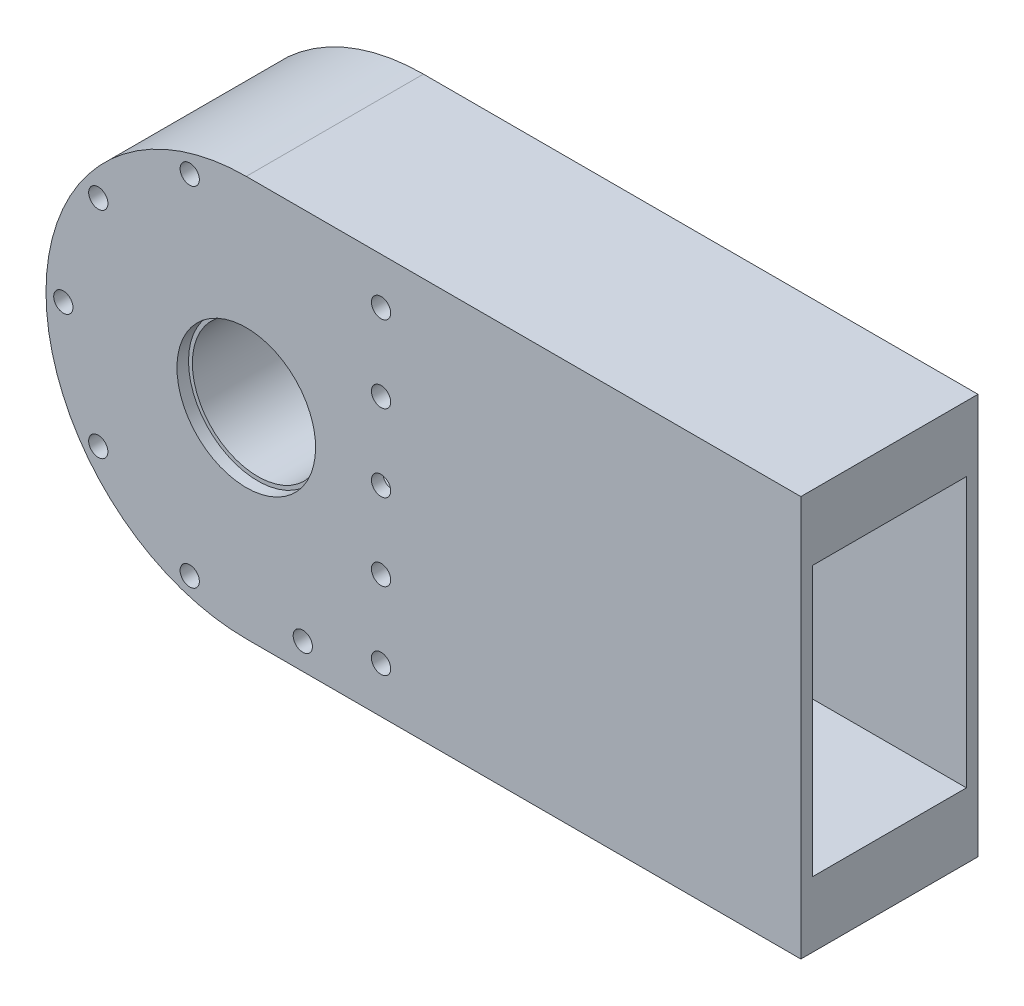
ISO-10303-21;
HEADER;
FILE_DESCRIPTION(('STEP AP214'),'2;1');
FILE_NAME('part.step','',(''),(''),'','','');
FILE_SCHEMA(('AUTOMOTIVE_DESIGN { 1 0 10303 214 1 1 1 1 }'));
ENDSEC;
DATA;
#1=APPLICATION_CONTEXT('core data for automotive mechanical design processes');
#2=APPLICATION_PROTOCOL_DEFINITION('international standard','automotive_design',2000,#1);
#3=PRODUCT_CONTEXT('',#1,'mechanical');
#4=PRODUCT('Part','Part','',(#3));
#5=PRODUCT_RELATED_PRODUCT_CATEGORY('part','',(#4));
#6=PRODUCT_DEFINITION_FORMATION('','',#4);
#7=PRODUCT_DEFINITION_CONTEXT('part definition',#1,'design');
#8=PRODUCT_DEFINITION('design','',#6,#7);
#9=PRODUCT_DEFINITION_SHAPE('','',#8);
#10=(LENGTH_UNIT() NAMED_UNIT(*) SI_UNIT(.MILLI.,.METRE.));
#11=(NAMED_UNIT(*) PLANE_ANGLE_UNIT() SI_UNIT($,.RADIAN.));
#12=(NAMED_UNIT(*) SI_UNIT($,.STERADIAN.) SOLID_ANGLE_UNIT());
#13=UNCERTAINTY_MEASURE_WITH_UNIT(LENGTH_MEASURE(1.E-05),#10,'distance_accuracy_value','');
#14=(GEOMETRIC_REPRESENTATION_CONTEXT(3) GLOBAL_UNCERTAINTY_ASSIGNED_CONTEXT((#13)) GLOBAL_UNIT_ASSIGNED_CONTEXT((#10,
#11,#12)) REPRESENTATION_CONTEXT('',''));
#15=CARTESIAN_POINT('',(0.,0.,0.));
#16=DIRECTION('',(0.,0.,1.));
#17=DIRECTION('',(1.,0.,0.));
#18=AXIS2_PLACEMENT_3D('',#15,#16,#17);
#19=CARTESIAN_POINT('',(0.,0.,40.));
#20=DIRECTION('',(0.,0.,1.));
#21=DIRECTION('',(1.,0.,0.));
#22=AXIS2_PLACEMENT_3D('',#19,#20,#21);
#23=PLANE('',#22);
#24=DIRECTION('',(-1.,0.,0.));
#25=VECTOR('',#24,1.);
#26=CARTESIAN_POINT('',(0.,5.,40.));
#27=LINE('',#26,#25);
#28=CARTESIAN_POINT('',(17.2916164657906,5.,40.));
#29=VERTEX_POINT('',#28);
#30=CARTESIAN_POINT('',(16.2480768092719,5.,40.));
#31=VERTEX_POINT('',#30);
#32=EDGE_CURVE('E262',#29,#31,#27,.T.);
#33=ORIENTED_EDGE('',*,*,#32,.F.);
#34=CARTESIAN_POINT('',(0.,0.,40.));
#35=DIRECTION('',(0.,0.,1.));
#36=DIRECTION('',(1.,0.,0.));
#37=AXIS2_PLACEMENT_3D('',#34,#35,#36);
#38=CIRCLE('',#37,18.);
#39=CARTESIAN_POINT('',(17.2916164657906,-5.,40.));
#40=VERTEX_POINT('',#39);
#41=EDGE_CURVE('E252',#29,#40,#38,.T.);
#42=ORIENTED_EDGE('',*,*,#41,.T.);
#43=DIRECTION('',(-1.,0.,0.));
#44=VECTOR('',#43,1.);
#45=CARTESIAN_POINT('',(0.,-5.,40.));
#46=LINE('',#45,#44);
#47=CARTESIAN_POINT('',(16.2480768092719,-5.,40.));
#48=VERTEX_POINT('',#47);
#49=EDGE_CURVE('E63',#40,#48,#46,.T.);
#50=ORIENTED_EDGE('',*,*,#49,.T.);
#51=CARTESIAN_POINT('',(0.,0.,40.));
#52=DIRECTION('',(0.,0.,1.));
#53=DIRECTION('',(1.,0.,0.));
#54=AXIS2_PLACEMENT_3D('',#51,#52,#53);
#55=CIRCLE('',#54,17.);
#56=EDGE_CURVE('E98',#31,#48,#55,.T.);
#57=ORIENTED_EDGE('',*,*,#56,.F.);
#58=EDGE_LOOP('',(#33,#42,#50,#57));
#59=FACE_BOUND('',#58,.T.);
#60=ADVANCED_FACE('F39',(#59),#23,.T.);
#61=CARTESIAN_POINT('',(0.,0.,40.));
#62=DIRECTION('',(0.,0.,-1.));
#63=DIRECTION('',(-1.,0.,0.));
#64=AXIS2_PLACEMENT_3D('',#61,#62,#63);
#65=CYLINDRICAL_SURFACE('',#64,17.);
#66=CARTESIAN_POINT('',(0.,0.,0.));
#67=DIRECTION('',(0.,0.,1.));
#68=DIRECTION('',(1.,0.,0.));
#69=AXIS2_PLACEMENT_3D('',#66,#67,#68);
#70=CIRCLE('',#69,17.);
#71=CARTESIAN_POINT('',(16.2480768092719,5.,0.));
#72=VERTEX_POINT('',#71);
#73=CARTESIAN_POINT('',(16.2480768092719,-5.,0.));
#74=VERTEX_POINT('',#73);
#75=EDGE_CURVE('E97',#72,#74,#70,.T.);
#76=ORIENTED_EDGE('',*,*,#75,.F.);
#77=DIRECTION('',(0.,0.,-1.));
#78=VECTOR('',#77,1.);
#79=CARTESIAN_POINT('',(16.2480768092719,5.,40.));
#80=LINE('',#79,#78);
#81=EDGE_CURVE('E11',#31,#72,#80,.T.);
#82=ORIENTED_EDGE('',*,*,#81,.F.);
#83=ORIENTED_EDGE('',*,*,#56,.T.);
#84=DIRECTION('',(0.,0.,-1.));
#85=VECTOR('',#84,1.);
#86=CARTESIAN_POINT('',(16.2480768092719,-5.,40.));
#87=LINE('',#86,#85);
#88=EDGE_CURVE('E92',#48,#74,#87,.T.);
#89=ORIENTED_EDGE('',*,*,#88,.T.);
#90=EDGE_LOOP('',(#76,#82,#83,#89));
#91=FACE_BOUND('',#90,.T.);
#92=ADVANCED_FACE('F41',(#91),#65,.F.);
#93=CARTESIAN_POINT('',(0.,5.,40.));
#94=DIRECTION('',(0.,-1.,0.));
#95=DIRECTION('',(0.,0.,-1.));
#96=AXIS2_PLACEMENT_3D('',#93,#94,#95);
#97=PLANE('',#96);
#98=DIRECTION('',(-1.,0.,0.));
#99=VECTOR('',#98,1.);
#100=CARTESIAN_POINT('',(0.,5.,0.));
#101=LINE('',#100,#99);
#102=CARTESIAN_POINT('',(40.,5.,0.));
#103=VERTEX_POINT('',#102);
#104=EDGE_CURVE('E117',#103,#72,#101,.T.);
#105=ORIENTED_EDGE('',*,*,#104,.F.);
#106=DIRECTION('',(0.,0.,-1.));
#107=VECTOR('',#106,1.);
#108=CARTESIAN_POINT('',(40.,5.,40.));
#109=LINE('',#108,#107);
#110=CARTESIAN_POINT('',(40.,5.,40.));
#111=VERTEX_POINT('',#110);
#112=EDGE_CURVE('E48',#111,#103,#109,.T.);
#113=ORIENTED_EDGE('',*,*,#112,.F.);
#114=EDGE_CURVE('E263',#111,#29,#27,.T.);
#115=ORIENTED_EDGE('',*,*,#114,.T.);
#116=ORIENTED_EDGE('',*,*,#32,.T.);
#117=ORIENTED_EDGE('',*,*,#81,.T.);
#118=EDGE_LOOP('',(#105,#113,#115,#116,#117));
#119=FACE_BOUND('',#118,.T.);
#120=ADVANCED_FACE('F167',(#119),#97,.T.);
#121=CARTESIAN_POINT('',(40.,0.,40.));
#122=DIRECTION('',(1.,0.,0.));
#123=DIRECTION('',(0.,0.,-1.));
#124=AXIS2_PLACEMENT_3D('',#121,#122,#123);
#125=PLANE('',#124);
#126=DIRECTION('',(0.,-1.,0.));
#127=VECTOR('',#126,1.);
#128=CARTESIAN_POINT('',(40.,0.,0.));
#129=LINE('',#128,#127);
#130=CARTESIAN_POINT('',(40.,35.,0.));
#131=VERTEX_POINT('',#130);
#132=EDGE_CURVE('E120',#131,#103,#129,.T.);
#133=ORIENTED_EDGE('',*,*,#132,.F.);
#134=DIRECTION('',(0.,0.,-1.));
#135=VECTOR('',#134,1.);
#136=CARTESIAN_POINT('',(40.,35.,40.));
#137=LINE('',#136,#135);
#138=CARTESIAN_POINT('',(40.,35.,40.));
#139=VERTEX_POINT('',#138);
#140=EDGE_CURVE('E154',#139,#131,#137,.T.);
#141=ORIENTED_EDGE('',*,*,#140,.F.);
#142=DIRECTION('',(0.,-1.,0.));
#143=VECTOR('',#142,1.);
#144=CARTESIAN_POINT('',(40.,0.,40.));
#145=LINE('',#144,#143);
#146=EDGE_CURVE('E164',#139,#111,#145,.T.);
#147=ORIENTED_EDGE('',*,*,#146,.T.);
#148=ORIENTED_EDGE('',*,*,#112,.T.);
#149=EDGE_LOOP('',(#133,#141,#147,#148));
#150=FACE_BOUND('',#149,.T.);
#151=ADVANCED_FACE('F160',(#150),#125,.T.);
#152=CARTESIAN_POINT('',(0.,35.,40.));
#153=DIRECTION('',(0.,1.,0.));
#154=DIRECTION('',(0.,0.,1.));
#155=AXIS2_PLACEMENT_3D('',#152,#153,#154);
#156=PLANE('',#155);
#157=DIRECTION('',(1.,0.,0.));
#158=VECTOR('',#157,1.);
#159=CARTESIAN_POINT('',(0.,35.,0.));
#160=LINE('',#159,#158);
#161=CARTESIAN_POINT('',(144.,35.,0.));
#162=VERTEX_POINT('',#161);
#163=EDGE_CURVE('E129',#131,#162,#160,.T.);
#164=ORIENTED_EDGE('',*,*,#163,.T.);
#165=DIRECTION('',(0.,0.,-1.));
#166=VECTOR('',#165,1.);
#167=CARTESIAN_POINT('',(144.,35.,40.));
#168=LINE('',#167,#166);
#169=CARTESIAN_POINT('',(144.,35.,40.));
#170=VERTEX_POINT('',#169);
#171=EDGE_CURVE('E152',#170,#162,#168,.T.);
#172=ORIENTED_EDGE('',*,*,#171,.F.);
#173=DIRECTION('',(1.,0.,0.));
#174=VECTOR('',#173,1.);
#175=CARTESIAN_POINT('',(0.,35.,40.));
#176=LINE('',#175,#174);
#177=EDGE_CURVE('E178',#139,#170,#176,.T.);
#178=ORIENTED_EDGE('',*,*,#177,.F.);
#179=ORIENTED_EDGE('',*,*,#140,.T.);
#180=EDGE_LOOP('',(#164,#172,#178,#179));
#181=FACE_BOUND('',#180,.T.);
#182=ADVANCED_FACE('F173',(#181),#156,.F.);
#183=CARTESIAN_POINT('',(0.,52.,40.));
#184=DIRECTION('',(0.,1.,0.));
#185=DIRECTION('',(0.,0.,1.));
#186=AXIS2_PLACEMENT_3D('',#183,#184,#185);
#187=PLANE('',#186);
#188=DIRECTION('',(0.,0.,-1.));
#189=VECTOR('',#188,1.);
#190=CARTESIAN_POINT('',(144.,52.,40.));
#191=LINE('',#190,#189);
#192=CARTESIAN_POINT('',(144.,52.,43.));
#193=VERTEX_POINT('',#192);
#194=CARTESIAN_POINT('',(144.,52.,-3.));
#195=VERTEX_POINT('',#194);
#196=EDGE_CURVE('E149',#193,#195,#191,.T.);
#197=ORIENTED_EDGE('',*,*,#196,.T.);
#198=DIRECTION('',(1.,0.,0.));
#199=VECTOR('',#198,1.);
#200=CARTESIAN_POINT('',(144.,52.,-3.));
#201=LINE('',#200,#199);
#202=CARTESIAN_POINT('',(0.,52.,-3.));
#203=VERTEX_POINT('',#202);
#204=EDGE_CURVE('E228',#203,#195,#201,.T.);
#205=ORIENTED_EDGE('',*,*,#204,.F.);
#206=DIRECTION('',(0.,0.,-1.));
#207=VECTOR('',#206,1.);
#208=CARTESIAN_POINT('',(0.,52.,40.));
#209=LINE('',#208,#207);
#210=CARTESIAN_POINT('',(0.,52.,43.));
#211=VERTEX_POINT('',#210);
#212=EDGE_CURVE('E146',#211,#203,#209,.T.);
#213=ORIENTED_EDGE('',*,*,#212,.F.);
#214=DIRECTION('',(-1.,0.,0.));
#215=VECTOR('',#214,1.);
#216=CARTESIAN_POINT('',(144.,52.,43.));
#217=LINE('',#216,#215);
#218=EDGE_CURVE('E254',#193,#211,#217,.T.);
#219=ORIENTED_EDGE('',*,*,#218,.F.);
#220=EDGE_LOOP('',(#197,#205,#213,#219));
#221=FACE_BOUND('',#220,.T.);
#222=ADVANCED_FACE('F229',(#221),#187,.T.);
#223=CARTESIAN_POINT('',(0.,0.,40.));
#224=DIRECTION('',(0.,0.,-1.));
#225=DIRECTION('',(-1.,0.,0.));
#226=AXIS2_PLACEMENT_3D('',#223,#224,#225);
#227=CYLINDRICAL_SURFACE('',#226,52.);
#228=ORIENTED_EDGE('',*,*,#212,.T.);
#229=CARTESIAN_POINT('',(0.,0.,-3.));
#230=DIRECTION('',(0.,0.,-1.));
#231=DIRECTION('',(-1.,0.,0.));
#232=AXIS2_PLACEMENT_3D('',#229,#230,#231);
#233=CIRCLE('',#232,52.);
#234=CARTESIAN_POINT('',(0.,-52.,-3.));
#235=VERTEX_POINT('',#234);
#236=EDGE_CURVE('E221',#235,#203,#233,.T.);
#237=ORIENTED_EDGE('',*,*,#236,.F.);
#238=DIRECTION('',(0.,0.,-1.));
#239=VECTOR('',#238,1.);
#240=CARTESIAN_POINT('',(0.,-52.,40.));
#241=LINE('',#240,#239);
#242=CARTESIAN_POINT('',(0.,-52.,43.));
#243=VERTEX_POINT('',#242);
#244=EDGE_CURVE('E143',#243,#235,#241,.T.);
#245=ORIENTED_EDGE('',*,*,#244,.F.);
#246=CARTESIAN_POINT('',(0.,0.,43.));
#247=DIRECTION('',(0.,0.,1.));
#248=DIRECTION('',(1.,0.,0.));
#249=AXIS2_PLACEMENT_3D('',#246,#247,#248);
#250=CIRCLE('',#249,52.);
#251=EDGE_CURVE('E223',#211,#243,#250,.T.);
#252=ORIENTED_EDGE('',*,*,#251,.F.);
#253=EDGE_LOOP('',(#228,#237,#245,#252));
#254=FACE_BOUND('',#253,.T.);
#255=ADVANCED_FACE('F219',(#254),#227,.T.);
#256=CARTESIAN_POINT('',(0.,-52.,40.));
#257=DIRECTION('',(0.,1.,0.));
#258=DIRECTION('',(0.,0.,1.));
#259=AXIS2_PLACEMENT_3D('',#256,#257,#258);
#260=PLANE('',#259);
#261=ORIENTED_EDGE('',*,*,#244,.T.);
#262=DIRECTION('',(-1.,0.,0.));
#263=VECTOR('',#262,1.);
#264=CARTESIAN_POINT('',(0.,-52.,-3.));
#265=LINE('',#264,#263);
#266=CARTESIAN_POINT('',(144.,-52.,-3.));
#267=VERTEX_POINT('',#266);
#268=EDGE_CURVE('E238',#267,#235,#265,.T.);
#269=ORIENTED_EDGE('',*,*,#268,.F.);
#270=DIRECTION('',(0.,0.,-1.));
#271=VECTOR('',#270,1.);
#272=CARTESIAN_POINT('',(144.,-52.,40.));
#273=LINE('',#272,#271);
#274=CARTESIAN_POINT('',(144.,-52.,43.));
#275=VERTEX_POINT('',#274);
#276=EDGE_CURVE('E140',#275,#267,#273,.T.);
#277=ORIENTED_EDGE('',*,*,#276,.F.);
#278=DIRECTION('',(1.,0.,0.));
#279=VECTOR('',#278,1.);
#280=CARTESIAN_POINT('',(0.,-52.,43.));
#281=LINE('',#280,#279);
#282=EDGE_CURVE('E123',#243,#275,#281,.T.);
#283=ORIENTED_EDGE('',*,*,#282,.F.);
#284=EDGE_LOOP('',(#261,#269,#277,#283));
#285=FACE_BOUND('',#284,.T.);
#286=ADVANCED_FACE('F306',(#285),#260,.F.);
#287=CARTESIAN_POINT('',(144.,0.,40.));
#288=DIRECTION('',(1.,0.,0.));
#289=DIRECTION('',(0.,0.,-1.));
#290=AXIS2_PLACEMENT_3D('',#287,#288,#289);
#291=PLANE('',#290);
#292=ORIENTED_EDGE('',*,*,#276,.T.);
#293=DIRECTION('',(0.,-1.,0.));
#294=VECTOR('',#293,1.);
#295=CARTESIAN_POINT('',(144.,-52.,-3.));
#296=LINE('',#295,#294);
#297=EDGE_CURVE('E233',#195,#267,#296,.T.);
#298=ORIENTED_EDGE('',*,*,#297,.F.);
#299=ORIENTED_EDGE('',*,*,#196,.F.);
#300=DIRECTION('',(0.,1.,0.));
#301=VECTOR('',#300,1.);
#302=CARTESIAN_POINT('',(144.,52.,43.));
#303=LINE('',#302,#301);
#304=EDGE_CURVE('E118',#275,#193,#303,.T.);
#305=ORIENTED_EDGE('',*,*,#304,.F.);
#306=EDGE_LOOP('',(#292,#298,#299,#305));
#307=FACE_BOUND('',#306,.T.);
#308=DIRECTION('',(0.,-1.,0.));
#309=VECTOR('',#308,1.);
#310=CARTESIAN_POINT('',(144.,-52.,0.));
#311=LINE('',#310,#309);
#312=CARTESIAN_POINT('',(144.,-35.,0.));
#313=VERTEX_POINT('',#312);
#314=EDGE_CURVE('E170',#162,#313,#311,.T.);
#315=ORIENTED_EDGE('',*,*,#314,.T.);
#316=DIRECTION('',(0.,0.,-1.));
#317=VECTOR('',#316,1.);
#318=CARTESIAN_POINT('',(144.,-35.,40.));
#319=LINE('',#318,#317);
#320=CARTESIAN_POINT('',(144.,-35.,40.));
#321=VERTEX_POINT('',#320);
#322=EDGE_CURVE('E138',#321,#313,#319,.T.);
#323=ORIENTED_EDGE('',*,*,#322,.F.);
#324=DIRECTION('',(0.,1.,0.));
#325=VECTOR('',#324,1.);
#326=CARTESIAN_POINT('',(144.,52.,40.));
#327=LINE('',#326,#325);
#328=EDGE_CURVE('E251',#321,#170,#327,.T.);
#329=ORIENTED_EDGE('',*,*,#328,.T.);
#330=ORIENTED_EDGE('',*,*,#171,.T.);
#331=EDGE_LOOP('',(#315,#323,#329,#330));
#332=FACE_BOUND('',#331,.T.);
#333=ADVANCED_FACE('F303',(#307,#332),#291,.T.);
#334=CARTESIAN_POINT('',(0.,-35.,40.));
#335=DIRECTION('',(0.,1.,0.));
#336=DIRECTION('',(0.,0.,1.));
#337=AXIS2_PLACEMENT_3D('',#334,#335,#336);
#338=PLANE('',#337);
#339=DIRECTION('',(1.,0.,0.));
#340=VECTOR('',#339,1.);
#341=CARTESIAN_POINT('',(0.,-35.,0.));
#342=LINE('',#341,#340);
#343=CARTESIAN_POINT('',(40.,-35.,0.));
#344=VERTEX_POINT('',#343);
#345=EDGE_CURVE('E132',#344,#313,#342,.T.);
#346=ORIENTED_EDGE('',*,*,#345,.F.);
#347=DIRECTION('',(0.,0.,-1.));
#348=VECTOR('',#347,1.);
#349=CARTESIAN_POINT('',(40.,-35.,40.));
#350=LINE('',#349,#348);
#351=CARTESIAN_POINT('',(40.,-35.,40.));
#352=VERTEX_POINT('',#351);
#353=EDGE_CURVE('E136',#352,#344,#350,.T.);
#354=ORIENTED_EDGE('',*,*,#353,.F.);
#355=DIRECTION('',(1.,0.,0.));
#356=VECTOR('',#355,1.);
#357=CARTESIAN_POINT('',(0.,-35.,40.));
#358=LINE('',#357,#356);
#359=EDGE_CURVE('E267',#352,#321,#358,.T.);
#360=ORIENTED_EDGE('',*,*,#359,.T.);
#361=ORIENTED_EDGE('',*,*,#322,.T.);
#362=EDGE_LOOP('',(#346,#354,#360,#361));
#363=FACE_BOUND('',#362,.T.);
#364=ADVANCED_FACE('F300',(#363),#338,.T.);
#365=CARTESIAN_POINT('',(40.,-5.,0.));
#366=VERTEX_POINT('',#365);
#367=EDGE_CURVE('E111',#366,#344,#129,.T.);
#368=ORIENTED_EDGE('',*,*,#367,.F.);
#369=DIRECTION('',(0.,0.,-1.));
#370=VECTOR('',#369,1.);
#371=CARTESIAN_POINT('',(40.,-5.,40.));
#372=LINE('',#371,#370);
#373=CARTESIAN_POINT('',(40.,-5.,40.));
#374=VERTEX_POINT('',#373);
#375=EDGE_CURVE('E100',#374,#366,#372,.T.);
#376=ORIENTED_EDGE('',*,*,#375,.F.);
#377=EDGE_CURVE('E266',#374,#352,#145,.T.);
#378=ORIENTED_EDGE('',*,*,#377,.T.);
#379=ORIENTED_EDGE('',*,*,#353,.T.);
#380=EDGE_LOOP('',(#368,#376,#378,#379));
#381=FACE_BOUND('',#380,.T.);
#382=ADVANCED_FACE('F297',(#381),#125,.T.);
#383=CARTESIAN_POINT('',(0.,-5.,40.));
#384=DIRECTION('',(0.,-1.,0.));
#385=DIRECTION('',(0.,0.,-1.));
#386=AXIS2_PLACEMENT_3D('',#383,#384,#385);
#387=PLANE('',#386);
#388=DIRECTION('',(-1.,0.,0.));
#389=VECTOR('',#388,1.);
#390=CARTESIAN_POINT('',(0.,-5.,0.));
#391=LINE('',#390,#389);
#392=EDGE_CURVE('E104',#366,#74,#391,.T.);
#393=ORIENTED_EDGE('',*,*,#392,.T.);
#394=ORIENTED_EDGE('',*,*,#88,.F.);
#395=ORIENTED_EDGE('',*,*,#49,.F.);
#396=EDGE_CURVE('E101',#374,#40,#46,.T.);
#397=ORIENTED_EDGE('',*,*,#396,.F.);
#398=ORIENTED_EDGE('',*,*,#375,.T.);
#399=EDGE_LOOP('',(#393,#394,#395,#397,#398));
#400=FACE_BOUND('',#399,.T.);
#401=ADVANCED_FACE('F105',(#400),#387,.F.);
#402=CARTESIAN_POINT('',(0.,0.,43.));
#403=DIRECTION('',(0.,0.,1.));
#404=DIRECTION('',(1.,0.,0.));
#405=AXIS2_PLACEMENT_3D('',#402,#403,#404);
#406=PLANE('',#405);
#407=CARTESIAN_POINT('',(14.6783072328196,-45.1751845240168,43.));
#408=DIRECTION('',(0.,0.,1.));
#409=DIRECTION('',(1.,0.,0.));
#410=AXIS2_PLACEMENT_3D('',#407,#408,#409);
#411=CIRCLE('',#410,2.50000000000971);
#412=CARTESIAN_POINT('',(17.1783072328293,-45.1751845240168,43.));
#413=VERTEX_POINT('',#412);
#414=EDGE_CURVE('E735',#413,#413,#411,.T.);
#415=ORIENTED_EDGE('',*,*,#414,.F.);
#416=EDGE_LOOP('',(#415));
#417=FACE_BOUND('',#416,.T.);
#418=CARTESIAN_POINT('',(-14.6783072327987,-45.1751845240178,43.));
#419=DIRECTION('',(0.,0.,1.));
#420=DIRECTION('',(1.,0.,0.));
#421=AXIS2_PLACEMENT_3D('',#418,#419,#420);
#422=CIRCLE('',#421,2.50000000000968);
#423=CARTESIAN_POINT('',(-12.178307232789,-45.1751845240178,43.));
#424=VERTEX_POINT('',#423);
#425=EDGE_CURVE('E731',#424,#424,#422,.T.);
#426=ORIENTED_EDGE('',*,*,#425,.F.);
#427=EDGE_LOOP('',(#426));
#428=FACE_BOUND('',#427,.T.);
#429=CARTESIAN_POINT('',(-38.4283072327986,-27.919799483893,43.));
#430=DIRECTION('',(0.,0.,1.));
#431=DIRECTION('',(1.,0.,0.));
#432=AXIS2_PLACEMENT_3D('',#429,#430,#431);
#433=CIRCLE('',#432,2.50000000000674);
#434=CARTESIAN_POINT('',(-35.9283072327919,-27.919799483893,43.));
#435=VERTEX_POINT('',#434);
#436=EDGE_CURVE('E725',#435,#435,#433,.T.);
#437=ORIENTED_EDGE('',*,*,#436,.F.);
#438=EDGE_LOOP('',(#437));
#439=FACE_BOUND('',#438,.T.);
#440=CARTESIAN_POINT('',(-47.4999999999911,-3.09948726604435E-12,43.));
#441=DIRECTION('',(0.,0.,1.));
#442=DIRECTION('',(1.,0.,0.));
#443=AXIS2_PLACEMENT_3D('',#440,#441,#442);
#444=CIRCLE('',#443,2.50000000000276);
#445=CARTESIAN_POINT('',(-44.9999999999883,-3.09948726604435E-12,43.));
#446=VERTEX_POINT('',#445);
#447=EDGE_CURVE('E719',#446,#446,#444,.T.);
#448=ORIENTED_EDGE('',*,*,#447,.F.);
#449=EDGE_LOOP('',(#448));
#450=FACE_BOUND('',#449,.T.);
#451=CARTESIAN_POINT('',(-38.4283072328056,27.9197994838891,43.));
#452=DIRECTION('',(0.,0.,1.));
#453=DIRECTION('',(1.,0.,0.));
#454=AXIS2_PLACEMENT_3D('',#451,#452,#453);
#455=CIRCLE('',#454,2.49999999999992);
#456=CARTESIAN_POINT('',(-35.9283072328057,27.9197994838891,43.));
#457=VERTEX_POINT('',#456);
#458=EDGE_CURVE('E713',#457,#457,#455,.T.);
#459=ORIENTED_EDGE('',*,*,#458,.F.);
#460=EDGE_LOOP('',(#459));
#461=FACE_BOUND('',#460,.T.);
#462=CARTESIAN_POINT('',(-14.6783072328101,45.1751845240198,43.));
#463=DIRECTION('',(0.,0.,1.));
#464=DIRECTION('',(1.,0.,0.));
#465=AXIS2_PLACEMENT_3D('',#462,#463,#464);
#466=CIRCLE('',#465,2.5);
#467=CARTESIAN_POINT('',(-12.1783072328101,45.1751845240198,43.));
#468=VERTEX_POINT('',#467);
#469=EDGE_CURVE('E707',#468,#468,#466,.T.);
#470=ORIENTED_EDGE('',*,*,#469,.F.);
#471=EDGE_LOOP('',(#470));
#472=FACE_BOUND('',#471,.T.);
#473=CARTESIAN_POINT('',(34.9999999999999,-20.,43.));
#474=DIRECTION('',(0.,0.,1.));
#475=DIRECTION('',(-1.,0.,0.));
#476=AXIS2_PLACEMENT_3D('',#473,#474,#475);
#477=CIRCLE('',#476,2.5);
#478=CARTESIAN_POINT('',(32.4999999999999,-20.,43.));
#479=VERTEX_POINT('',#478);
#480=EDGE_CURVE('E701',#479,#479,#477,.T.);
#481=ORIENTED_EDGE('',*,*,#480,.F.);
#482=EDGE_LOOP('',(#481));
#483=FACE_BOUND('',#482,.T.);
#484=CARTESIAN_POINT('',(34.9999999999999,-40.,43.));
#485=DIRECTION('',(0.,0.,1.));
#486=DIRECTION('',(-1.,0.,0.));
#487=AXIS2_PLACEMENT_3D('',#484,#485,#486);
#488=CIRCLE('',#487,2.5);
#489=CARTESIAN_POINT('',(32.4999999999999,-40.,43.));
#490=VERTEX_POINT('',#489);
#491=EDGE_CURVE('E695',#490,#490,#488,.T.);
#492=ORIENTED_EDGE('',*,*,#491,.F.);
#493=EDGE_LOOP('',(#492));
#494=FACE_BOUND('',#493,.T.);
#495=CARTESIAN_POINT('',(34.9999999999999,40.,43.));
#496=DIRECTION('',(0.,0.,1.));
#497=DIRECTION('',(1.,0.,0.));
#498=AXIS2_PLACEMENT_3D('',#495,#496,#497);
#499=CIRCLE('',#498,2.5);
#500=CARTESIAN_POINT('',(37.4999999999999,40.,43.));
#501=VERTEX_POINT('',#500);
#502=EDGE_CURVE('E689',#501,#501,#499,.T.);
#503=ORIENTED_EDGE('',*,*,#502,.F.);
#504=EDGE_LOOP('',(#503));
#505=FACE_BOUND('',#504,.T.);
#506=CARTESIAN_POINT('',(34.9999999999999,20.,43.));
#507=DIRECTION('',(0.,0.,1.));
#508=DIRECTION('',(1.,0.,0.));
#509=AXIS2_PLACEMENT_3D('',#506,#507,#508);
#510=CIRCLE('',#509,2.5);
#511=CARTESIAN_POINT('',(37.4999999999999,20.,43.));
#512=VERTEX_POINT('',#511);
#513=EDGE_CURVE('E680',#512,#512,#510,.T.);
#514=ORIENTED_EDGE('',*,*,#513,.F.);
#515=EDGE_LOOP('',(#514));
#516=FACE_BOUND('',#515,.T.);
#517=CARTESIAN_POINT('',(35.,0.,43.));
#518=DIRECTION('',(0.,0.,1.));
#519=DIRECTION('',(1.,0.,0.));
#520=AXIS2_PLACEMENT_3D('',#517,#518,#519);
#521=CIRCLE('',#520,2.5);
#522=CARTESIAN_POINT('',(37.5,0.,43.));
#523=VERTEX_POINT('',#522);
#524=EDGE_CURVE('E669',#523,#523,#521,.T.);
#525=ORIENTED_EDGE('',*,*,#524,.F.);
#526=EDGE_LOOP('',(#525));
#527=FACE_BOUND('',#526,.T.);
#528=ORIENTED_EDGE('',*,*,#218,.T.);
#529=ORIENTED_EDGE('',*,*,#251,.T.);
#530=ORIENTED_EDGE('',*,*,#282,.T.);
#531=ORIENTED_EDGE('',*,*,#304,.T.);
#532=EDGE_LOOP('',(#528,#529,#530,#531));
#533=FACE_BOUND('',#532,.T.);
#534=CARTESIAN_POINT('',(0.,0.,43.));
#535=DIRECTION('',(0.,0.,1.));
#536=DIRECTION('',(1.,0.,0.));
#537=AXIS2_PLACEMENT_3D('',#534,#535,#536);
#538=CIRCLE('',#537,18.);
#539=CARTESIAN_POINT('',(18.,0.,43.));
#540=VERTEX_POINT('',#539);
#541=EDGE_CURVE('E248',#540,#540,#538,.T.);
#542=ORIENTED_EDGE('',*,*,#541,.F.);
#543=EDGE_LOOP('',(#542));
#544=FACE_BOUND('',#543,.T.);
#545=ADVANCED_FACE('F285',(#417,#428,#439,#450,#461,#472,#483,#494,#505,#516,#527,#533,#544),
#406,.T.);
#546=CARTESIAN_POINT('',(0.,0.,40.));
#547=DIRECTION('',(0.,0.,1.));
#548=DIRECTION('',(1.,0.,0.));
#549=AXIS2_PLACEMENT_3D('',#546,#547,#548);
#550=PLANE('',#549);
#551=CARTESIAN_POINT('',(35.,0.,40.));
#552=DIRECTION('',(0.,0.,1.));
#553=DIRECTION('',(1.,0.,0.));
#554=AXIS2_PLACEMENT_3D('',#551,#552,#553);
#555=CIRCLE('',#554,2.5);
#556=CARTESIAN_POINT('',(37.5,0.,40.));
#557=VERTEX_POINT('',#556);
#558=EDGE_CURVE('E43',#557,#557,#555,.T.);
#559=ORIENTED_EDGE('',*,*,#558,.T.);
#560=EDGE_LOOP('',(#559));
#561=FACE_BOUND('',#560,.T.);
#562=ORIENTED_EDGE('',*,*,#114,.F.);
#563=ORIENTED_EDGE('',*,*,#146,.F.);
#564=ORIENTED_EDGE('',*,*,#177,.T.);
#565=ORIENTED_EDGE('',*,*,#328,.F.);
#566=ORIENTED_EDGE('',*,*,#359,.F.);
#567=ORIENTED_EDGE('',*,*,#377,.F.);
#568=ORIENTED_EDGE('',*,*,#396,.T.);
#569=EDGE_CURVE('E54',#40,#29,#38,.T.);
#570=ORIENTED_EDGE('',*,*,#569,.T.);
#571=EDGE_LOOP('',(#562,#563,#564,#565,#566,#567,#568,#570));
#572=FACE_BOUND('',#571,.T.);
#573=ADVANCED_FACE('F273',(#561,#572),#550,.F.);
#574=CARTESIAN_POINT('',(0.,0.,43.));
#575=DIRECTION('',(0.,0.,-1.));
#576=DIRECTION('',(-1.,0.,0.));
#577=AXIS2_PLACEMENT_3D('',#574,#575,#576);
#578=CYLINDRICAL_SURFACE('',#577,18.);
#579=ORIENTED_EDGE('',*,*,#541,.T.);
#580=EDGE_LOOP('',(#579));
#581=FACE_BOUND('',#580,.T.);
#582=ORIENTED_EDGE('',*,*,#41,.F.);
#583=ORIENTED_EDGE('',*,*,#569,.F.);
#584=EDGE_LOOP('',(#582,#583));
#585=FACE_BOUND('',#584,.T.);
#586=ADVANCED_FACE('F275',(#581,#585),#578,.F.);
#587=CARTESIAN_POINT('',(0.,0.,0.));
#588=DIRECTION('',(0.,0.,-1.));
#589=DIRECTION('',(-1.,0.,0.));
#590=AXIS2_PLACEMENT_3D('',#587,#588,#589);
#591=PLANE('',#590);
#592=ORIENTED_EDGE('',*,*,#367,.T.);
#593=ORIENTED_EDGE('',*,*,#345,.T.);
#594=ORIENTED_EDGE('',*,*,#314,.F.);
#595=ORIENTED_EDGE('',*,*,#163,.F.);
#596=ORIENTED_EDGE('',*,*,#132,.T.);
#597=ORIENTED_EDGE('',*,*,#104,.T.);
#598=ORIENTED_EDGE('',*,*,#75,.T.);
#599=ORIENTED_EDGE('',*,*,#392,.F.);
#600=EDGE_LOOP('',(#592,#593,#594,#595,#596,#597,#598,#599));
#601=FACE_BOUND('',#600,.T.);
#602=ADVANCED_FACE('F114',(#601),#591,.F.);
#603=CARTESIAN_POINT('',(0.,0.,-3.));
#604=DIRECTION('',(0.,0.,-1.));
#605=DIRECTION('',(-1.,0.,0.));
#606=AXIS2_PLACEMENT_3D('',#603,#604,#605);
#607=PLANE('',#606);
#608=CARTESIAN_POINT('',(8.99999999999998,42.5,-3.));
#609=DIRECTION('',(0.,0.,-1.));
#610=DIRECTION('',(1.,0.,0.));
#611=AXIS2_PLACEMENT_3D('',#608,#609,#610);
#612=CIRCLE('',#611,2.5);
#613=CARTESIAN_POINT('',(11.5,42.5,-3.));
#614=VERTEX_POINT('',#613);
#615=EDGE_CURVE('E633',#614,#614,#612,.T.);
#616=ORIENTED_EDGE('',*,*,#615,.F.);
#617=EDGE_LOOP('',(#616));
#618=FACE_BOUND('',#617,.T.);
#619=CARTESIAN_POINT('',(8.99999999999998,-42.5,-3.));
#620=DIRECTION('',(0.,0.,-1.));
#621=DIRECTION('',(-1.,0.,0.));
#622=AXIS2_PLACEMENT_3D('',#619,#620,#621);
#623=CIRCLE('',#622,2.5);
#624=CARTESIAN_POINT('',(6.49999999999998,-42.5,-3.));
#625=VERTEX_POINT('',#624);
#626=EDGE_CURVE('E637',#625,#625,#623,.T.);
#627=ORIENTED_EDGE('',*,*,#626,.F.);
#628=EDGE_LOOP('',(#627));
#629=FACE_BOUND('',#628,.T.);
#630=CARTESIAN_POINT('',(135.,-42.5,-3.));
#631=DIRECTION('',(0.,0.,-1.));
#632=DIRECTION('',(1.,0.,0.));
#633=AXIS2_PLACEMENT_3D('',#630,#631,#632);
#634=CIRCLE('',#633,2.5);
#635=CARTESIAN_POINT('',(137.5,-42.5,-3.));
#636=VERTEX_POINT('',#635);
#637=EDGE_CURVE('E641',#636,#636,#634,.T.);
#638=ORIENTED_EDGE('',*,*,#637,.F.);
#639=EDGE_LOOP('',(#638));
#640=FACE_BOUND('',#639,.T.);
#641=CARTESIAN_POINT('',(-45.,0.,-3.));
#642=DIRECTION('',(0.,0.,-1.));
#643=DIRECTION('',(-1.,0.,0.));
#644=AXIS2_PLACEMENT_3D('',#641,#642,#643);
#645=CIRCLE('',#644,2.5);
#646=CARTESIAN_POINT('',(-47.5,0.,-3.));
#647=VERTEX_POINT('',#646);
#648=EDGE_CURVE('E645',#647,#647,#645,.T.);
#649=ORIENTED_EDGE('',*,*,#648,.F.);
#650=EDGE_LOOP('',(#649));
#651=FACE_BOUND('',#650,.T.);
#652=CARTESIAN_POINT('',(135.,42.5,-3.));
#653=DIRECTION('',(0.,0.,-1.));
#654=DIRECTION('',(-1.,0.,0.));
#655=AXIS2_PLACEMENT_3D('',#652,#653,#654);
#656=CIRCLE('',#655,2.5);
#657=CARTESIAN_POINT('',(132.5,42.5,-3.));
#658=VERTEX_POINT('',#657);
#659=EDGE_CURVE('E243',#658,#658,#656,.T.);
#660=ORIENTED_EDGE('',*,*,#659,.F.);
#661=EDGE_LOOP('',(#660));
#662=FACE_BOUND('',#661,.T.);
#663=ORIENTED_EDGE('',*,*,#236,.T.);
#664=ORIENTED_EDGE('',*,*,#204,.T.);
#665=ORIENTED_EDGE('',*,*,#297,.T.);
#666=ORIENTED_EDGE('',*,*,#268,.T.);
#667=EDGE_LOOP('',(#663,#664,#665,#666));
#668=FACE_BOUND('',#667,.T.);
#669=ADVANCED_FACE('F236',(#618,#629,#640,#651,#662,#668),#607,.T.);
#670=CARTESIAN_POINT('',(135.,42.5,7.));
#671=DIRECTION('',(0.,0.,-1.));
#672=DIRECTION('',(-1.,0.,0.));
#673=AXIS2_PLACEMENT_3D('',#670,#671,#672);
#674=CYLINDRICAL_SURFACE('',#673,2.5);
#675=CARTESIAN_POINT('',(135.,42.5,7.));
#676=DIRECTION('',(0.,0.,-1.));
#677=DIRECTION('',(-1.,0.,0.));
#678=AXIS2_PLACEMENT_3D('',#675,#676,#677);
#679=CIRCLE('',#678,2.5);
#680=CARTESIAN_POINT('',(132.5,42.5,7.));
#681=VERTEX_POINT('',#680);
#682=EDGE_CURVE('E240',#681,#681,#679,.T.);
#683=ORIENTED_EDGE('',*,*,#682,.F.);
#684=EDGE_LOOP('',(#683));
#685=FACE_BOUND('',#684,.T.);
#686=ORIENTED_EDGE('',*,*,#659,.T.);
#687=EDGE_LOOP('',(#686));
#688=FACE_BOUND('',#687,.T.);
#689=ADVANCED_FACE('F621',(#685,#688),#674,.F.);
#690=CARTESIAN_POINT('',(135.,42.5,7.));
#691=DIRECTION('',(0.,0.,-1.));
#692=DIRECTION('',(-1.,0.,0.));
#693=AXIS2_PLACEMENT_3D('',#690,#691,#692);
#694=PLANE('',#693);
#695=ORIENTED_EDGE('',*,*,#682,.T.);
#696=EDGE_LOOP('',(#695));
#697=FACE_BOUND('',#696,.T.);
#698=ADVANCED_FACE('F604',(#697),#694,.T.);
#699=CARTESIAN_POINT('',(-45.,0.,7.));
#700=DIRECTION('',(0.,0.,-1.));
#701=DIRECTION('',(-1.,0.,0.));
#702=AXIS2_PLACEMENT_3D('',#699,#700,#701);
#703=CYLINDRICAL_SURFACE('',#702,2.5);
#704=CARTESIAN_POINT('',(-45.,0.,7.));
#705=DIRECTION('',(0.,0.,-1.));
#706=DIRECTION('',(-1.,0.,0.));
#707=AXIS2_PLACEMENT_3D('',#704,#705,#706);
#708=CIRCLE('',#707,2.5);
#709=CARTESIAN_POINT('',(-47.5,0.,7.));
#710=VERTEX_POINT('',#709);
#711=EDGE_CURVE('E666',#710,#710,#708,.T.);
#712=ORIENTED_EDGE('',*,*,#711,.F.);
#713=EDGE_LOOP('',(#712));
#714=FACE_BOUND('',#713,.T.);
#715=ORIENTED_EDGE('',*,*,#648,.T.);
#716=EDGE_LOOP('',(#715));
#717=FACE_BOUND('',#716,.T.);
#718=ADVANCED_FACE('F600',(#714,#717),#703,.F.);
#719=CARTESIAN_POINT('',(-45.,0.,7.));
#720=DIRECTION('',(0.,0.,-1.));
#721=DIRECTION('',(-1.,0.,0.));
#722=AXIS2_PLACEMENT_3D('',#719,#720,#721);
#723=PLANE('',#722);
#724=ORIENTED_EDGE('',*,*,#711,.T.);
#725=EDGE_LOOP('',(#724));
#726=FACE_BOUND('',#725,.T.);
#727=ADVANCED_FACE('F596',(#726),#723,.T.);
#728=CARTESIAN_POINT('',(135.,-42.5,7.));
#729=DIRECTION('',(0.,0.,-1.));
#730=DIRECTION('',(-1.,0.,0.));
#731=AXIS2_PLACEMENT_3D('',#728,#729,#730);
#732=CYLINDRICAL_SURFACE('',#731,2.5);
#733=CARTESIAN_POINT('',(135.,-42.5,7.));
#734=DIRECTION('',(0.,0.,-1.));
#735=DIRECTION('',(1.,0.,0.));
#736=AXIS2_PLACEMENT_3D('',#733,#734,#735);
#737=CIRCLE('',#736,2.5);
#738=CARTESIAN_POINT('',(137.5,-42.5,7.));
#739=VERTEX_POINT('',#738);
#740=EDGE_CURVE('E661',#739,#739,#737,.T.);
#741=ORIENTED_EDGE('',*,*,#740,.F.);
#742=EDGE_LOOP('',(#741));
#743=FACE_BOUND('',#742,.T.);
#744=ORIENTED_EDGE('',*,*,#637,.T.);
#745=EDGE_LOOP('',(#744));
#746=FACE_BOUND('',#745,.T.);
#747=ADVANCED_FACE('F592',(#743,#746),#732,.F.);
#748=CARTESIAN_POINT('',(135.,-42.5,7.));
#749=DIRECTION('',(0.,0.,1.));
#750=DIRECTION('',(1.,0.,0.));
#751=AXIS2_PLACEMENT_3D('',#748,#749,#750);
#752=PLANE('',#751);
#753=ORIENTED_EDGE('',*,*,#740,.T.);
#754=EDGE_LOOP('',(#753));
#755=FACE_BOUND('',#754,.T.);
#756=ADVANCED_FACE('F588',(#755),#752,.F.);
#757=CARTESIAN_POINT('',(8.99999999999998,-42.5,7.));
#758=DIRECTION('',(0.,0.,-1.));
#759=DIRECTION('',(-1.,0.,0.));
#760=AXIS2_PLACEMENT_3D('',#757,#758,#759);
#761=CYLINDRICAL_SURFACE('',#760,2.5);
#762=CARTESIAN_POINT('',(8.99999999999998,-42.5,7.));
#763=DIRECTION('',(0.,0.,-1.));
#764=DIRECTION('',(-1.,0.,0.));
#765=AXIS2_PLACEMENT_3D('',#762,#763,#764);
#766=CIRCLE('',#765,2.5);
#767=CARTESIAN_POINT('',(6.49999999999998,-42.5,7.));
#768=VERTEX_POINT('',#767);
#769=EDGE_CURVE('E654',#768,#768,#766,.T.);
#770=ORIENTED_EDGE('',*,*,#769,.F.);
#771=EDGE_LOOP('',(#770));
#772=FACE_BOUND('',#771,.T.);
#773=ORIENTED_EDGE('',*,*,#626,.T.);
#774=EDGE_LOOP('',(#773));
#775=FACE_BOUND('',#774,.T.);
#776=ADVANCED_FACE('F591',(#772,#775),#761,.F.);
#777=CARTESIAN_POINT('',(8.99999999999998,-42.5,7.));
#778=DIRECTION('',(0.,0.,-1.));
#779=DIRECTION('',(-1.,0.,0.));
#780=AXIS2_PLACEMENT_3D('',#777,#778,#779);
#781=PLANE('',#780);
#782=ORIENTED_EDGE('',*,*,#769,.T.);
#783=EDGE_LOOP('',(#782));
#784=FACE_BOUND('',#783,.T.);
#785=ADVANCED_FACE('F611',(#784),#781,.T.);
#786=CARTESIAN_POINT('',(8.99999999999998,42.5,7.));
#787=DIRECTION('',(0.,0.,-1.));
#788=DIRECTION('',(-1.,0.,0.));
#789=AXIS2_PLACEMENT_3D('',#786,#787,#788);
#790=CYLINDRICAL_SURFACE('',#789,2.5);
#791=CARTESIAN_POINT('',(8.99999999999998,42.5,7.));
#792=DIRECTION('',(0.,0.,-1.));
#793=DIRECTION('',(1.,0.,0.));
#794=AXIS2_PLACEMENT_3D('',#791,#792,#793);
#795=CIRCLE('',#794,2.5);
#796=CARTESIAN_POINT('',(11.5,42.5,7.));
#797=VERTEX_POINT('',#796);
#798=EDGE_CURVE('E649',#797,#797,#795,.T.);
#799=ORIENTED_EDGE('',*,*,#798,.F.);
#800=EDGE_LOOP('',(#799));
#801=FACE_BOUND('',#800,.T.);
#802=ORIENTED_EDGE('',*,*,#615,.T.);
#803=EDGE_LOOP('',(#802));
#804=FACE_BOUND('',#803,.T.);
#805=ADVANCED_FACE('F607',(#801,#804),#790,.F.);
#806=CARTESIAN_POINT('',(8.99999999999998,42.5,7.));
#807=DIRECTION('',(0.,0.,1.));
#808=DIRECTION('',(1.,0.,0.));
#809=AXIS2_PLACEMENT_3D('',#806,#807,#808);
#810=PLANE('',#809);
#811=ORIENTED_EDGE('',*,*,#798,.T.);
#812=EDGE_LOOP('',(#811));
#813=FACE_BOUND('',#812,.T.);
#814=ADVANCED_FACE('F380',(#813),#810,.F.);
#815=CARTESIAN_POINT('',(35.,0.,18.));
#816=DIRECTION('',(0.,0.,1.));
#817=DIRECTION('',(1.,0.,0.));
#818=AXIS2_PLACEMENT_3D('',#815,#816,#817);
#819=CYLINDRICAL_SURFACE('',#818,2.5);
#820=ORIENTED_EDGE('',*,*,#524,.T.);
#821=EDGE_LOOP('',(#820));
#822=FACE_BOUND('',#821,.T.);
#823=ORIENTED_EDGE('',*,*,#558,.F.);
#824=EDGE_LOOP('',(#823));
#825=FACE_BOUND('',#824,.T.);
#826=ADVANCED_FACE('F374',(#822,#825),#819,.F.);
#827=CARTESIAN_POINT('',(34.9999999999999,20.,18.));
#828=DIRECTION('',(0.,0.,1.));
#829=DIRECTION('',(1.,0.,0.));
#830=AXIS2_PLACEMENT_3D('',#827,#828,#829);
#831=CYLINDRICAL_SURFACE('',#830,2.5);
#832=CARTESIAN_POINT('',(34.9999999999999,20.,18.));
#833=DIRECTION('',(0.,0.,1.));
#834=DIRECTION('',(1.,0.,0.));
#835=AXIS2_PLACEMENT_3D('',#832,#833,#834);
#836=CIRCLE('',#835,2.5);
#837=CARTESIAN_POINT('',(37.4999999999999,20.,18.));
#838=VERTEX_POINT('',#837);
#839=EDGE_CURVE('E677',#838,#838,#836,.T.);
#840=ORIENTED_EDGE('',*,*,#839,.F.);
#841=EDGE_LOOP('',(#840));
#842=FACE_BOUND('',#841,.T.);
#843=ORIENTED_EDGE('',*,*,#513,.T.);
#844=EDGE_LOOP('',(#843));
#845=FACE_BOUND('',#844,.T.);
#846=ADVANCED_FACE('F379',(#842,#845),#831,.F.);
#847=CARTESIAN_POINT('',(34.9999999999999,20.,18.));
#848=DIRECTION('',(0.,0.,1.));
#849=DIRECTION('',(1.,0.,0.));
#850=AXIS2_PLACEMENT_3D('',#847,#848,#849);
#851=PLANE('',#850);
#852=ORIENTED_EDGE('',*,*,#839,.T.);
#853=EDGE_LOOP('',(#852));
#854=FACE_BOUND('',#853,.T.);
#855=ADVANCED_FACE('F392',(#854),#851,.T.);
#856=CARTESIAN_POINT('',(34.9999999999999,40.,18.));
#857=DIRECTION('',(0.,0.,1.));
#858=DIRECTION('',(1.,0.,0.));
#859=AXIS2_PLACEMENT_3D('',#856,#857,#858);
#860=CYLINDRICAL_SURFACE('',#859,2.5);
#861=CARTESIAN_POINT('',(34.9999999999999,40.,18.));
#862=DIRECTION('',(0.,0.,1.));
#863=DIRECTION('',(1.,0.,0.));
#864=AXIS2_PLACEMENT_3D('',#861,#862,#863);
#865=CIRCLE('',#864,2.5);
#866=CARTESIAN_POINT('',(37.4999999999999,40.,18.));
#867=VERTEX_POINT('',#866);
#868=EDGE_CURVE('E684',#867,#867,#865,.T.);
#869=ORIENTED_EDGE('',*,*,#868,.F.);
#870=EDGE_LOOP('',(#869));
#871=FACE_BOUND('',#870,.T.);
#872=ORIENTED_EDGE('',*,*,#502,.T.);
#873=EDGE_LOOP('',(#872));
#874=FACE_BOUND('',#873,.T.);
#875=ADVANCED_FACE('F402',(#871,#874),#860,.F.);
#876=CARTESIAN_POINT('',(34.9999999999999,40.,18.));
#877=DIRECTION('',(0.,0.,1.));
#878=DIRECTION('',(1.,0.,0.));
#879=AXIS2_PLACEMENT_3D('',#876,#877,#878);
#880=PLANE('',#879);
#881=ORIENTED_EDGE('',*,*,#868,.T.);
#882=EDGE_LOOP('',(#881));
#883=FACE_BOUND('',#882,.T.);
#884=ADVANCED_FACE('F412',(#883),#880,.T.);
#885=CARTESIAN_POINT('',(34.9999999999999,-40.,18.));
#886=DIRECTION('',(0.,0.,1.));
#887=DIRECTION('',(1.,0.,0.));
#888=AXIS2_PLACEMENT_3D('',#885,#886,#887);
#889=CYLINDRICAL_SURFACE('',#888,2.5);
#890=CARTESIAN_POINT('',(34.9999999999999,-40.,18.));
#891=DIRECTION('',(0.,0.,1.));
#892=DIRECTION('',(-1.,0.,0.));
#893=AXIS2_PLACEMENT_3D('',#890,#891,#892);
#894=CIRCLE('',#893,2.5);
#895=CARTESIAN_POINT('',(32.4999999999999,-40.,18.));
#896=VERTEX_POINT('',#895);
#897=EDGE_CURVE('E692',#896,#896,#894,.T.);
#898=ORIENTED_EDGE('',*,*,#897,.F.);
#899=EDGE_LOOP('',(#898));
#900=FACE_BOUND('',#899,.T.);
#901=ORIENTED_EDGE('',*,*,#491,.T.);
#902=EDGE_LOOP('',(#901));
#903=FACE_BOUND('',#902,.T.);
#904=ADVANCED_FACE('F422',(#900,#903),#889,.F.);
#905=CARTESIAN_POINT('',(34.9999999999999,-40.,18.));
#906=DIRECTION('',(0.,0.,-1.));
#907=DIRECTION('',(-1.,0.,0.));
#908=AXIS2_PLACEMENT_3D('',#905,#906,#907);
#909=PLANE('',#908);
#910=ORIENTED_EDGE('',*,*,#897,.T.);
#911=EDGE_LOOP('',(#910));
#912=FACE_BOUND('',#911,.T.);
#913=ADVANCED_FACE('F432',(#912),#909,.F.);
#914=CARTESIAN_POINT('',(34.9999999999999,-20.,18.));
#915=DIRECTION('',(0.,0.,1.));
#916=DIRECTION('',(1.,0.,0.));
#917=AXIS2_PLACEMENT_3D('',#914,#915,#916);
#918=CYLINDRICAL_SURFACE('',#917,2.5);
#919=CARTESIAN_POINT('',(34.9999999999999,-20.,18.));
#920=DIRECTION('',(0.,0.,1.));
#921=DIRECTION('',(-1.,0.,0.));
#922=AXIS2_PLACEMENT_3D('',#919,#920,#921);
#923=CIRCLE('',#922,2.5);
#924=CARTESIAN_POINT('',(32.4999999999999,-20.,18.));
#925=VERTEX_POINT('',#924);
#926=EDGE_CURVE('E698',#925,#925,#923,.T.);
#927=ORIENTED_EDGE('',*,*,#926,.F.);
#928=EDGE_LOOP('',(#927));
#929=FACE_BOUND('',#928,.T.);
#930=ORIENTED_EDGE('',*,*,#480,.T.);
#931=EDGE_LOOP('',(#930));
#932=FACE_BOUND('',#931,.T.);
#933=ADVANCED_FACE('F442',(#929,#932),#918,.F.);
#934=CARTESIAN_POINT('',(34.9999999999999,-20.,18.));
#935=DIRECTION('',(0.,0.,-1.));
#936=DIRECTION('',(-1.,0.,0.));
#937=AXIS2_PLACEMENT_3D('',#934,#935,#936);
#938=PLANE('',#937);
#939=ORIENTED_EDGE('',*,*,#926,.T.);
#940=EDGE_LOOP('',(#939));
#941=FACE_BOUND('',#940,.T.);
#942=ADVANCED_FACE('F452',(#941),#938,.F.);
#943=CARTESIAN_POINT('',(-14.6783072328101,45.1751845240198,18.));
#944=DIRECTION('',(0.,0.,1.));
#945=DIRECTION('',(1.,0.,0.));
#946=AXIS2_PLACEMENT_3D('',#943,#944,#945);
#947=CYLINDRICAL_SURFACE('',#946,2.5);
#948=CARTESIAN_POINT('',(-14.6783072328101,45.1751845240198,18.));
#949=DIRECTION('',(0.,0.,1.));
#950=DIRECTION('',(1.,0.,0.));
#951=AXIS2_PLACEMENT_3D('',#948,#949,#950);
#952=CIRCLE('',#951,2.5);
#953=CARTESIAN_POINT('',(-12.1783072328101,45.1751845240198,18.));
#954=VERTEX_POINT('',#953);
#955=EDGE_CURVE('E704',#954,#954,#952,.T.);
#956=ORIENTED_EDGE('',*,*,#955,.F.);
#957=EDGE_LOOP('',(#956));
#958=FACE_BOUND('',#957,.T.);
#959=ORIENTED_EDGE('',*,*,#469,.T.);
#960=EDGE_LOOP('',(#959));
#961=FACE_BOUND('',#960,.T.);
#962=ADVANCED_FACE('F462',(#958,#961),#947,.F.);
#963=CARTESIAN_POINT('',(-14.6783072328101,45.1751845240198,18.));
#964=DIRECTION('',(0.,0.,1.));
#965=DIRECTION('',(1.,0.,0.));
#966=AXIS2_PLACEMENT_3D('',#963,#964,#965);
#967=PLANE('',#966);
#968=ORIENTED_EDGE('',*,*,#955,.T.);
#969=EDGE_LOOP('',(#968));
#970=FACE_BOUND('',#969,.T.);
#971=ADVANCED_FACE('F472',(#970),#967,.T.);
#972=CARTESIAN_POINT('',(-38.4283072328056,27.9197994838891,18.));
#973=DIRECTION('',(0.,0.,1.));
#974=DIRECTION('',(1.,0.,0.));
#975=AXIS2_PLACEMENT_3D('',#972,#973,#974);
#976=CYLINDRICAL_SURFACE('',#975,2.49999999999992);
#977=CARTESIAN_POINT('',(-38.4283072328056,27.9197994838891,18.));
#978=DIRECTION('',(0.,0.,1.));
#979=DIRECTION('',(1.,0.,0.));
#980=AXIS2_PLACEMENT_3D('',#977,#978,#979);
#981=CIRCLE('',#980,2.49999999999992);
#982=CARTESIAN_POINT('',(-35.9283072328057,27.9197994838891,18.));
#983=VERTEX_POINT('',#982);
#984=EDGE_CURVE('E710',#983,#983,#981,.T.);
#985=ORIENTED_EDGE('',*,*,#984,.F.);
#986=EDGE_LOOP('',(#985));
#987=FACE_BOUND('',#986,.T.);
#988=ORIENTED_EDGE('',*,*,#458,.T.);
#989=EDGE_LOOP('',(#988));
#990=FACE_BOUND('',#989,.T.);
#991=ADVANCED_FACE('F482',(#987,#990),#976,.F.);
#992=CARTESIAN_POINT('',(-38.4283072328056,27.9197994838891,18.));
#993=DIRECTION('',(0.,0.,1.));
#994=DIRECTION('',(1.,0.,0.));
#995=AXIS2_PLACEMENT_3D('',#992,#993,#994);
#996=PLANE('',#995);
#997=ORIENTED_EDGE('',*,*,#984,.T.);
#998=EDGE_LOOP('',(#997));
#999=FACE_BOUND('',#998,.T.);
#1000=ADVANCED_FACE('F492',(#999),#996,.T.);
#1001=CARTESIAN_POINT('',(-47.4999999999911,-3.09948726604435E-12,18.));
#1002=DIRECTION('',(0.,0.,1.));
#1003=DIRECTION('',(1.,0.,0.));
#1004=AXIS2_PLACEMENT_3D('',#1001,#1002,#1003);
#1005=CYLINDRICAL_SURFACE('',#1004,2.50000000000276);
#1006=CARTESIAN_POINT('',(-47.4999999999911,-3.09948726604435E-12,18.));
#1007=DIRECTION('',(0.,0.,1.));
#1008=DIRECTION('',(1.,0.,0.));
#1009=AXIS2_PLACEMENT_3D('',#1006,#1007,#1008);
#1010=CIRCLE('',#1009,2.50000000000276);
#1011=CARTESIAN_POINT('',(-44.9999999999883,-3.09948726604435E-12,18.));
#1012=VERTEX_POINT('',#1011);
#1013=EDGE_CURVE('E716',#1012,#1012,#1010,.T.);
#1014=ORIENTED_EDGE('',*,*,#1013,.F.);
#1015=EDGE_LOOP('',(#1014));
#1016=FACE_BOUND('',#1015,.T.);
#1017=ORIENTED_EDGE('',*,*,#447,.T.);
#1018=EDGE_LOOP('',(#1017));
#1019=FACE_BOUND('',#1018,.T.);
#1020=ADVANCED_FACE('F502',(#1016,#1019),#1005,.F.);
#1021=CARTESIAN_POINT('',(-47.4999999999911,-3.09948726604435E-12,18.));
#1022=DIRECTION('',(0.,0.,1.));
#1023=DIRECTION('',(1.,0.,0.));
#1024=AXIS2_PLACEMENT_3D('',#1021,#1022,#1023);
#1025=PLANE('',#1024);
#1026=ORIENTED_EDGE('',*,*,#1013,.T.);
#1027=EDGE_LOOP('',(#1026));
#1028=FACE_BOUND('',#1027,.T.);
#1029=ADVANCED_FACE('F512',(#1028),#1025,.T.);
#1030=CARTESIAN_POINT('',(-38.4283072327986,-27.919799483893,18.));
#1031=DIRECTION('',(0.,0.,1.));
#1032=DIRECTION('',(1.,0.,0.));
#1033=AXIS2_PLACEMENT_3D('',#1030,#1031,#1032);
#1034=CYLINDRICAL_SURFACE('',#1033,2.50000000000674);
#1035=CARTESIAN_POINT('',(-38.4283072327986,-27.919799483893,18.));
#1036=DIRECTION('',(0.,0.,1.));
#1037=DIRECTION('',(1.,0.,0.));
#1038=AXIS2_PLACEMENT_3D('',#1035,#1036,#1037);
#1039=CIRCLE('',#1038,2.50000000000674);
#1040=CARTESIAN_POINT('',(-35.9283072327919,-27.919799483893,18.));
#1041=VERTEX_POINT('',#1040);
#1042=EDGE_CURVE('E722',#1041,#1041,#1039,.T.);
#1043=ORIENTED_EDGE('',*,*,#1042,.F.);
#1044=EDGE_LOOP('',(#1043));
#1045=FACE_BOUND('',#1044,.T.);
#1046=ORIENTED_EDGE('',*,*,#436,.T.);
#1047=EDGE_LOOP('',(#1046));
#1048=FACE_BOUND('',#1047,.T.);
#1049=ADVANCED_FACE('F522',(#1045,#1048),#1034,.F.);
#1050=CARTESIAN_POINT('',(-38.4283072327986,-27.919799483893,18.));
#1051=DIRECTION('',(0.,0.,1.));
#1052=DIRECTION('',(1.,0.,0.));
#1053=AXIS2_PLACEMENT_3D('',#1050,#1051,#1052);
#1054=PLANE('',#1053);
#1055=ORIENTED_EDGE('',*,*,#1042,.T.);
#1056=EDGE_LOOP('',(#1055));
#1057=FACE_BOUND('',#1056,.T.);
#1058=ADVANCED_FACE('F532',(#1057),#1054,.T.);
#1059=CARTESIAN_POINT('',(-14.6783072327987,-45.1751845240178,18.));
#1060=DIRECTION('',(0.,0.,1.));
#1061=DIRECTION('',(1.,0.,0.));
#1062=AXIS2_PLACEMENT_3D('',#1059,#1060,#1061);
#1063=CYLINDRICAL_SURFACE('',#1062,2.50000000000968);
#1064=CARTESIAN_POINT('',(-14.6783072327987,-45.1751845240178,18.));
#1065=DIRECTION('',(0.,0.,1.));
#1066=DIRECTION('',(1.,0.,0.));
#1067=AXIS2_PLACEMENT_3D('',#1064,#1065,#1066);
#1068=CIRCLE('',#1067,2.50000000000968);
#1069=CARTESIAN_POINT('',(-12.178307232789,-45.1751845240178,18.));
#1070=VERTEX_POINT('',#1069);
#1071=EDGE_CURVE('E728',#1070,#1070,#1068,.T.);
#1072=ORIENTED_EDGE('',*,*,#1071,.F.);
#1073=EDGE_LOOP('',(#1072));
#1074=FACE_BOUND('',#1073,.T.);
#1075=ORIENTED_EDGE('',*,*,#425,.T.);
#1076=EDGE_LOOP('',(#1075));
#1077=FACE_BOUND('',#1076,.T.);
#1078=ADVANCED_FACE('F542',(#1074,#1077),#1063,.F.);
#1079=CARTESIAN_POINT('',(-14.6783072327987,-45.1751845240178,18.));
#1080=DIRECTION('',(0.,0.,1.));
#1081=DIRECTION('',(1.,0.,0.));
#1082=AXIS2_PLACEMENT_3D('',#1079,#1080,#1081);
#1083=PLANE('',#1082);
#1084=ORIENTED_EDGE('',*,*,#1071,.T.);
#1085=EDGE_LOOP('',(#1084));
#1086=FACE_BOUND('',#1085,.T.);
#1087=ADVANCED_FACE('F552',(#1086),#1083,.T.);
#1088=CARTESIAN_POINT('',(14.6783072328196,-45.1751845240168,18.));
#1089=DIRECTION('',(0.,0.,1.));
#1090=DIRECTION('',(1.,0.,0.));
#1091=AXIS2_PLACEMENT_3D('',#1088,#1089,#1090);
#1092=CYLINDRICAL_SURFACE('',#1091,2.50000000000971);
#1093=CARTESIAN_POINT('',(14.6783072328196,-45.1751845240168,18.));
#1094=DIRECTION('',(0.,0.,1.));
#1095=DIRECTION('',(1.,0.,0.));
#1096=AXIS2_PLACEMENT_3D('',#1093,#1094,#1095);
#1097=CIRCLE('',#1096,2.50000000000971);
#1098=CARTESIAN_POINT('',(17.1783072328293,-45.1751845240168,18.));
#1099=VERTEX_POINT('',#1098);
#1100=EDGE_CURVE('E734',#1099,#1099,#1097,.T.);
#1101=ORIENTED_EDGE('',*,*,#1100,.F.);
#1102=EDGE_LOOP('',(#1101));
#1103=FACE_BOUND('',#1102,.T.);
#1104=ORIENTED_EDGE('',*,*,#414,.T.);
#1105=EDGE_LOOP('',(#1104));
#1106=FACE_BOUND('',#1105,.T.);
#1107=ADVANCED_FACE('F562',(#1103,#1106),#1092,.F.);
#1108=CARTESIAN_POINT('',(14.6783072328196,-45.1751845240168,18.));
#1109=DIRECTION('',(0.,0.,1.));
#1110=DIRECTION('',(1.,0.,0.));
#1111=AXIS2_PLACEMENT_3D('',#1108,#1109,#1110);
#1112=PLANE('',#1111);
#1113=ORIENTED_EDGE('',*,*,#1100,.T.);
#1114=EDGE_LOOP('',(#1113));
#1115=FACE_BOUND('',#1114,.T.);
#1116=ADVANCED_FACE('F572',(#1115),#1112,.T.);
#1117=CLOSED_SHELL('',(#60,#92,#120,#151,#182,#222,#255,#286,#333,#364,#382,#401,#545,#573,#586,
#602,#669,#689,#698,#718,#727,#747,#756,#776,#785,#805,#814,#826,#846,#855,#875,#884,#904,#913,
#933,#942,#962,#971,#991,#1000,#1020,#1029,#1049,#1058,#1078,#1087,#1107,#1116));
#1118=MANIFOLD_SOLID_BREP('B2',#1117);
#1119=ADVANCED_BREP_SHAPE_REPRESENTATION('',(#18,#1118),#14);
#1120=SHAPE_DEFINITION_REPRESENTATION(#9,#1119);
ENDSEC;
END-ISO-10303-21;
